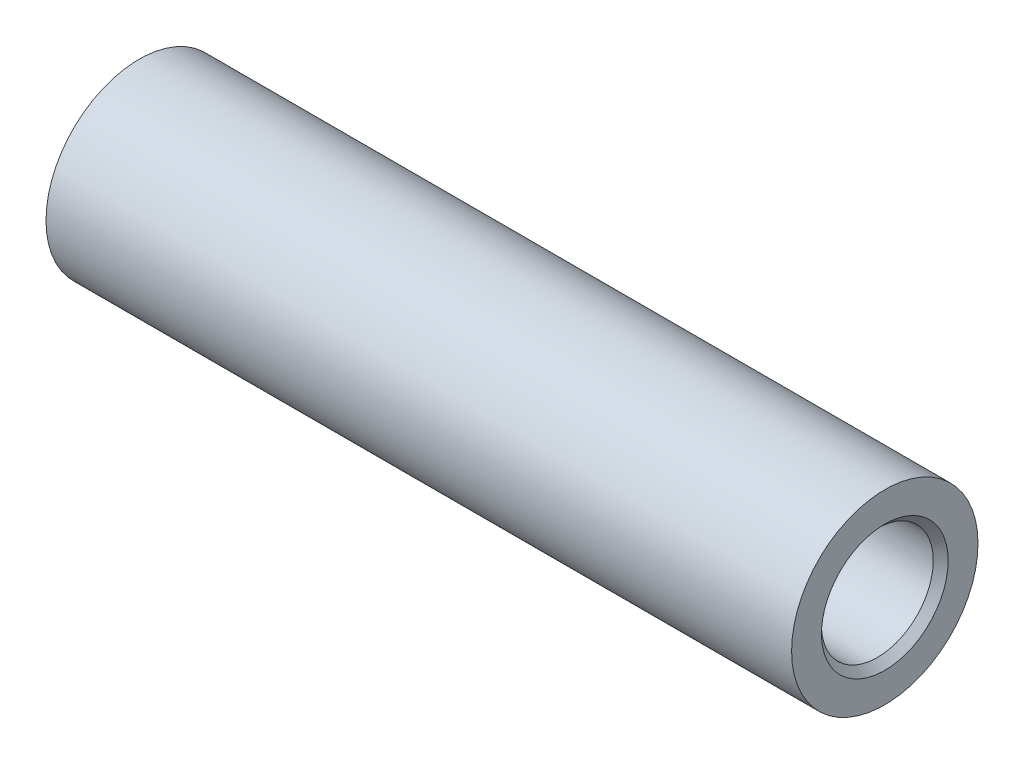
ISO-10303-21;
HEADER;
FILE_DESCRIPTION(('STEP AP214'),'2;1');
FILE_NAME('part.step','',(''),(''),'','','');
FILE_SCHEMA(('AUTOMOTIVE_DESIGN { 1 0 10303 214 1 1 1 1 }'));
ENDSEC;
DATA;
#1=APPLICATION_CONTEXT('core data for automotive mechanical design processes');
#2=APPLICATION_PROTOCOL_DEFINITION('international standard','automotive_design',2000,#1);
#3=PRODUCT_CONTEXT('',#1,'mechanical');
#4=PRODUCT('Part','Part','',(#3));
#5=PRODUCT_RELATED_PRODUCT_CATEGORY('part','',(#4));
#6=PRODUCT_DEFINITION_FORMATION('','',#4);
#7=PRODUCT_DEFINITION_CONTEXT('part definition',#1,'design');
#8=PRODUCT_DEFINITION('design','',#6,#7);
#9=PRODUCT_DEFINITION_SHAPE('','',#8);
#10=(LENGTH_UNIT() NAMED_UNIT(*) SI_UNIT(.MILLI.,.METRE.));
#11=(NAMED_UNIT(*) PLANE_ANGLE_UNIT() SI_UNIT($,.RADIAN.));
#12=(NAMED_UNIT(*) SI_UNIT($,.STERADIAN.) SOLID_ANGLE_UNIT());
#13=UNCERTAINTY_MEASURE_WITH_UNIT(LENGTH_MEASURE(1.E-05),#10,'distance_accuracy_value','');
#14=(GEOMETRIC_REPRESENTATION_CONTEXT(3) GLOBAL_UNCERTAINTY_ASSIGNED_CONTEXT((#13)) GLOBAL_UNIT_ASSIGNED_CONTEXT((#10,
#11,#12)) REPRESENTATION_CONTEXT('',''));
#15=CARTESIAN_POINT('',(0.,0.,0.));
#16=DIRECTION('',(0.,0.,1.));
#17=DIRECTION('',(1.,0.,0.));
#18=AXIS2_PLACEMENT_3D('',#15,#16,#17);
#19=CARTESIAN_POINT('',(14.,0.,0.));
#20=DIRECTION('',(-1.,0.,0.));
#21=DIRECTION('',(0.,0.,1.));
#22=AXIS2_PLACEMENT_3D('',#19,#20,#21);
#23=CYLINDRICAL_SURFACE('',#22,3.);
#24=CARTESIAN_POINT('',(2.,0.,0.));
#25=DIRECTION('',(1.,0.,0.));
#26=DIRECTION('',(0.,0.,-1.));
#27=AXIS2_PLACEMENT_3D('',#24,#25,#26);
#28=CIRCLE('',#27,3.);
#29=CARTESIAN_POINT('',(2.,2.5,-1.6583123951777));
#30=VERTEX_POINT('',#29);
#31=CARTESIAN_POINT('',(2.,2.5,1.6583123951777));
#32=VERTEX_POINT('',#31);
#33=EDGE_CURVE('E88',#30,#32,#28,.T.);
#34=ORIENTED_EDGE('',*,*,#33,.T.);
#35=DIRECTION('',(-1.,0.,0.));
#36=VECTOR('',#35,1.);
#37=CARTESIAN_POINT('',(14.,2.5,1.6583123951777));
#38=LINE('',#37,#36);
#39=CARTESIAN_POINT('',(14.,2.5,1.6583123951777));
#40=VERTEX_POINT('',#39);
#41=EDGE_CURVE('E12',#40,#32,#38,.T.);
#42=ORIENTED_EDGE('',*,*,#41,.F.);
#43=CARTESIAN_POINT('',(14.,0.,0.));
#44=DIRECTION('',(1.,0.,0.));
#45=DIRECTION('',(0.,0.,-1.));
#46=AXIS2_PLACEMENT_3D('',#43,#44,#45);
#47=CIRCLE('',#46,3.);
#48=CARTESIAN_POINT('',(14.,2.5,-1.6583123951777));
#49=VERTEX_POINT('',#48);
#50=EDGE_CURVE('E87',#49,#40,#47,.T.);
#51=ORIENTED_EDGE('',*,*,#50,.F.);
#52=DIRECTION('',(-1.,0.,0.));
#53=VECTOR('',#52,1.);
#54=CARTESIAN_POINT('',(14.,2.5,-1.6583123951777));
#55=LINE('',#54,#53);
#56=EDGE_CURVE('E65',#49,#30,#55,.T.);
#57=ORIENTED_EDGE('',*,*,#56,.T.);
#58=EDGE_LOOP('',(#34,#42,#51,#57));
#59=FACE_BOUND('',#58,.T.);
#60=ADVANCED_FACE('F57',(#59),#23,.T.);
#61=CARTESIAN_POINT('',(14.,2.5,1.6583123951777));
#62=DIRECTION('',(0.,1.,0.));
#63=DIRECTION('',(0.,0.,1.));
#64=AXIS2_PLACEMENT_3D('',#61,#62,#63);
#65=PLANE('',#64);
#66=DIRECTION('',(0.,0.,-1.));
#67=VECTOR('',#66,1.);
#68=CARTESIAN_POINT('',(2.,2.5,1.6583123951777));
#69=LINE('',#68,#67);
#70=EDGE_CURVE('E80',#32,#30,#69,.T.);
#71=ORIENTED_EDGE('',*,*,#70,.T.);
#72=ORIENTED_EDGE('',*,*,#56,.F.);
#73=DIRECTION('',(0.,0.,-1.));
#74=VECTOR('',#73,1.);
#75=CARTESIAN_POINT('',(14.,2.5,1.6583123951777));
#76=LINE('',#75,#74);
#77=EDGE_CURVE('E72',#40,#49,#76,.T.);
#78=ORIENTED_EDGE('',*,*,#77,.F.);
#79=ORIENTED_EDGE('',*,*,#41,.T.);
#80=EDGE_LOOP('',(#71,#72,#78,#79));
#81=FACE_BOUND('',#80,.T.);
#82=ADVANCED_FACE('F83',(#81),#65,.F.);
#83=CARTESIAN_POINT('',(14.,0.,0.));
#84=DIRECTION('',(1.,0.,0.));
#85=DIRECTION('',(0.,0.,-1.));
#86=AXIS2_PLACEMENT_3D('',#83,#84,#85);
#87=PLANE('',#86);
#88=ORIENTED_EDGE('',*,*,#50,.T.);
#89=ORIENTED_EDGE('',*,*,#77,.T.);
#90=EDGE_LOOP('',(#88,#89));
#91=FACE_BOUND('',#90,.T.);
#92=ADVANCED_FACE('F95',(#91),#87,.T.);
#93=CARTESIAN_POINT('',(2.,0.,0.));
#94=DIRECTION('',(1.,0.,0.));
#95=DIRECTION('',(0.,0.,-1.));
#96=AXIS2_PLACEMENT_3D('',#93,#94,#95);
#97=PLANE('',#96);
#98=ORIENTED_EDGE('',*,*,#33,.F.);
#99=ORIENTED_EDGE('',*,*,#70,.F.);
#100=EDGE_LOOP('',(#98,#99));
#101=FACE_BOUND('',#100,.T.);
#102=ADVANCED_FACE('F91',(#101),#97,.F.);
#103=CLOSED_SHELL('',(#60,#82,#92,#102));
#104=MANIFOLD_SOLID_BREP('B2',#103);
#105=CARTESIAN_POINT('',(0.,0.,0.));
#106=DIRECTION('',(-1.,0.,0.));
#107=DIRECTION('',(0.,0.,1.));
#108=AXIS2_PLACEMENT_3D('',#105,#106,#107);
#109=CYLINDRICAL_SURFACE('',#108,4.);
#110=CARTESIAN_POINT('',(-20.6,0.,0.));
#111=DIRECTION('',(1.,0.,0.));
#112=DIRECTION('',(0.,0.,-1.));
#113=AXIS2_PLACEMENT_3D('',#110,#111,#112);
#114=CIRCLE('',#113,4.);
#115=CARTESIAN_POINT('',(-20.6,0.,-4.));
#116=VERTEX_POINT('',#115);
#117=EDGE_CURVE('E147',#116,#116,#114,.F.);
#118=ORIENTED_EDGE('',*,*,#117,.T.);
#119=EDGE_LOOP('',(#118));
#120=FACE_BOUND('',#119,.T.);
#121=DIRECTION('',(1.,0.,0.));
#122=VECTOR('',#121,1.);
#123=CARTESIAN_POINT('',(-15.,3.52019103303803,-1.89954075789877));
#124=LINE('',#123,#122);
#125=CARTESIAN_POINT('',(-15.,3.52019103303803,-1.89954075789877));
#126=VERTEX_POINT('',#125);
#127=CARTESIAN_POINT('',(0.,3.52019103303803,-1.89954075789877));
#128=VERTEX_POINT('',#127);
#129=EDGE_CURVE('E154',#126,#128,#124,.T.);
#130=ORIENTED_EDGE('',*,*,#129,.F.);
#131=CARTESIAN_POINT('',(-15.,0.,0.));
#132=DIRECTION('',(-1.,0.,0.));
#133=DIRECTION('',(0.,0.,1.));
#134=AXIS2_PLACEMENT_3D('',#131,#132,#133);
#135=CIRCLE('',#134,4.);
#136=CARTESIAN_POINT('',(-15.,3.47942111272299,1.97322799502174));
#137=VERTEX_POINT('',#136);
#138=EDGE_CURVE('E174',#137,#126,#135,.T.);
#139=ORIENTED_EDGE('',*,*,#138,.F.);
#140=DIRECTION('',(1.,0.,0.));
#141=VECTOR('',#140,1.);
#142=CARTESIAN_POINT('',(-15.,3.47942111272299,1.97322799502174));
#143=LINE('',#142,#141);
#144=CARTESIAN_POINT('',(0.,3.47942111272299,1.97322799502174));
#145=VERTEX_POINT('',#144);
#146=EDGE_CURVE('E168',#137,#145,#143,.T.);
#147=ORIENTED_EDGE('',*,*,#146,.T.);
#148=CARTESIAN_POINT('',(0.,0.,0.));
#149=DIRECTION('',(-1.,0.,0.));
#150=DIRECTION('',(0.,0.,1.));
#151=AXIS2_PLACEMENT_3D('',#148,#149,#150);
#152=CIRCLE('',#151,4.);
#153=EDGE_CURVE('E177',#128,#145,#152,.T.);
#154=ORIENTED_EDGE('',*,*,#153,.F.);
#155=EDGE_LOOP('',(#130,#139,#147,#154));
#156=FACE_BOUND('',#155,.T.);
#157=ADVANCED_FACE('F137',(#120,#156),#109,.F.);
#158=CARTESIAN_POINT('',(0.,0.,0.));
#159=DIRECTION('',(-1.,0.,0.));
#160=DIRECTION('',(0.,0.,1.));
#161=AXIS2_PLACEMENT_3D('',#158,#159,#160);
#162=PLANE('',#161);
#163=ORIENTED_EDGE('',*,*,#153,.T.);
#164=DIRECTION('',(0.,-0.0105267481604234,0.999944592251574));
#165=VECTOR('',#164,1.);
#166=CARTESIAN_POINT('',(0.,3.52019103303803,-1.89954075789877));
#167=LINE('',#166,#165);
#168=EDGE_CURVE('E165',#128,#145,#167,.T.);
#169=ORIENTED_EDGE('',*,*,#168,.F.);
#170=EDGE_LOOP('',(#163,#169));
#171=FACE_BOUND('',#170,.T.);
#172=ADVANCED_FACE('F180',(#171),#162,.T.);
#173=CARTESIAN_POINT('',(-21.,0.,0.));
#174=DIRECTION('',(1.,0.,0.));
#175=DIRECTION('',(0.,0.,-1.));
#176=AXIS2_PLACEMENT_3D('',#173,#174,#175);
#177=CYLINDRICAL_SURFACE('',#176,5.);
#178=CARTESIAN_POINT('',(-21.,0.,0.));
#179=DIRECTION('',(1.,0.,0.));
#180=DIRECTION('',(0.,0.,-1.));
#181=AXIS2_PLACEMENT_3D('',#178,#179,#180);
#182=CIRCLE('',#181,5.);
#183=CARTESIAN_POINT('',(-21.,0.,-5.));
#184=VERTEX_POINT('',#183);
#185=EDGE_CURVE('E194',#184,#184,#182,.T.);
#186=CARTESIAN_POINT('',(19.,0.,0.));
#187=DIRECTION('',(1.,0.,0.));
#188=DIRECTION('',(0.,0.,-1.));
#189=AXIS2_PLACEMENT_3D('',#186,#187,#188);
#190=CIRCLE('',#189,5.);
#191=CARTESIAN_POINT('',(19.,0.,-5.));
#192=VERTEX_POINT('',#191);
#193=EDGE_CURVE('E187',#192,#192,#190,.T.);
#194=CARTESIAN_POINT('',(-21.,0.,-5.));
#195=CARTESIAN_POINT('',(-20.5833333333333,0.,-5.));
#196=CARTESIAN_POINT('',(-20.1666666666667,0.,-5.));
#197=CARTESIAN_POINT('',(-19.3333333333333,0.,-5.));
#198=CARTESIAN_POINT('',(-18.9166666666667,0.,-5.));
#199=CARTESIAN_POINT('',(-18.0833333333333,0.,-5.));
#200=CARTESIAN_POINT('',(-17.6666666666667,0.,-5.));
#201=CARTESIAN_POINT('',(-16.8333333333333,0.,-5.));
#202=CARTESIAN_POINT('',(-16.4166666666667,0.,-5.));
#203=CARTESIAN_POINT('',(-15.5833333333333,0.,-5.));
#204=CARTESIAN_POINT('',(-15.1666666666667,0.,-5.));
#205=CARTESIAN_POINT('',(-14.3333333333333,0.,-5.));
#206=CARTESIAN_POINT('',(-13.9166666666667,0.,-5.));
#207=CARTESIAN_POINT('',(-13.0833333333333,0.,-5.));
#208=CARTESIAN_POINT('',(-12.6666666666667,0.,-5.));
#209=CARTESIAN_POINT('',(-11.8333333333333,0.,-5.));
#210=CARTESIAN_POINT('',(-11.4166666666667,0.,-5.));
#211=CARTESIAN_POINT('',(-10.5833333333333,0.,-5.));
#212=CARTESIAN_POINT('',(-10.1666666666667,0.,-5.));
#213=CARTESIAN_POINT('',(-9.33333333333334,0.,-5.));
#214=CARTESIAN_POINT('',(-8.91666666666667,0.,-5.));
#215=CARTESIAN_POINT('',(-8.08333333333334,0.,-5.));
#216=CARTESIAN_POINT('',(-7.66666666666667,0.,-5.));
#217=CARTESIAN_POINT('',(-6.83333333333334,0.,-5.));
#218=CARTESIAN_POINT('',(-6.41666666666667,0.,-5.));
#219=CARTESIAN_POINT('',(-5.58333333333334,0.,-5.));
#220=CARTESIAN_POINT('',(-5.16666666666667,0.,-5.));
#221=CARTESIAN_POINT('',(-4.33333333333334,0.,-5.));
#222=CARTESIAN_POINT('',(-3.91666666666667,0.,-5.));
#223=CARTESIAN_POINT('',(-3.08333333333334,0.,-5.));
#224=CARTESIAN_POINT('',(-2.66666666666667,0.,-5.));
#225=CARTESIAN_POINT('',(-1.83333333333334,0.,-5.));
#226=CARTESIAN_POINT('',(-1.41666666666667,0.,-5.));
#227=CARTESIAN_POINT('',(-0.583333333333337,0.,-5.));
#228=CARTESIAN_POINT('',(-0.16666666666667,0.,-5.));
#229=CARTESIAN_POINT('',(0.666666666666664,0.,-5.));
#230=CARTESIAN_POINT('',(1.08333333333333,0.,-5.));
#231=CARTESIAN_POINT('',(1.91666666666666,0.,-5.));
#232=CARTESIAN_POINT('',(2.33333333333333,0.,-5.));
#233=CARTESIAN_POINT('',(3.16666666666666,0.,-5.));
#234=CARTESIAN_POINT('',(3.58333333333333,0.,-5.));
#235=CARTESIAN_POINT('',(4.41666666666666,0.,-5.));
#236=CARTESIAN_POINT('',(4.83333333333333,0.,-5.));
#237=CARTESIAN_POINT('',(5.66666666666666,0.,-5.));
#238=CARTESIAN_POINT('',(6.08333333333333,0.,-5.));
#239=CARTESIAN_POINT('',(6.91666666666666,0.,-5.));
#240=CARTESIAN_POINT('',(7.33333333333333,0.,-5.));
#241=CARTESIAN_POINT('',(8.16666666666666,0.,-5.));
#242=CARTESIAN_POINT('',(8.58333333333333,0.,-5.));
#243=CARTESIAN_POINT('',(9.41666666666667,0.,-5.));
#244=CARTESIAN_POINT('',(9.83333333333333,0.,-5.));
#245=CARTESIAN_POINT('',(10.6666666666667,0.,-5.));
#246=CARTESIAN_POINT('',(11.0833333333333,0.,-5.));
#247=CARTESIAN_POINT('',(11.9166666666667,0.,-5.));
#248=CARTESIAN_POINT('',(12.3333333333333,0.,-5.));
#249=CARTESIAN_POINT('',(13.1666666666667,0.,-5.));
#250=CARTESIAN_POINT('',(13.5833333333333,0.,-5.));
#251=CARTESIAN_POINT('',(14.4166666666667,0.,-5.));
#252=CARTESIAN_POINT('',(14.8333333333333,0.,-5.));
#253=CARTESIAN_POINT('',(15.6666666666667,0.,-5.));
#254=CARTESIAN_POINT('',(16.0833333333333,0.,-5.));
#255=CARTESIAN_POINT('',(16.9166666666667,0.,-5.));
#256=CARTESIAN_POINT('',(17.3333333333333,0.,-5.));
#257=CARTESIAN_POINT('',(18.1666666666667,0.,-5.));
#258=CARTESIAN_POINT('',(18.5833333333333,0.,-5.));
#259=CARTESIAN_POINT('',(19.,0.,-5.));
#260=B_SPLINE_CURVE_WITH_KNOTS('',3,(#194,#195,#196,#197,#198,#199,#200,#201,#202,#203,#204,
#205,#206,#207,#208,#209,#210,#211,#212,#213,#214,#215,#216,#217,#218,#219,#220,#221,#222,#223,
#224,#225,#226,#227,#228,#229,#230,#231,#232,#233,#234,#235,#236,#237,#238,#239,#240,#241,#242,
#243,#244,#245,#246,#247,#248,#249,#250,#251,#252,#253,#254,#255,#256,#257,#258,#259),
.UNSPECIFIED.,.F.,.F.,(4,2,2,2,2,2,2,2,2,2,2,2,2,2,2,2,2,2,2,2,2,2,2,2,2,2,2,2,2,2,2,2,4),(0.,
1.25,2.5,3.75,5.,6.25,7.5,8.75,10.,11.25,12.5,13.75,15.,16.25,17.5,18.75,20.,21.25,22.5,23.75,
25.,26.25,27.5,28.75,30.,31.25,32.5,33.75,35.,36.25,37.5,38.75,40.),.UNSPECIFIED.);
#261=EDGE_CURVE('BSEAM224',#184,#192,#260,.T.);
#262=ORIENTED_EDGE('',*,*,#185,.T.);
#263=ORIENTED_EDGE('',*,*,#193,.F.);
#264=ORIENTED_EDGE('',*,*,#261,.T.);
#265=ORIENTED_EDGE('',*,*,#261,.F.);
#266=EDGE_LOOP('',(#262,#264,#263,#265));
#267=FACE_BOUND('',#266,.T.);
#268=ADVANCED_FACE('F224',(#267),#177,.T.);
#269=CARTESIAN_POINT('',(-21.,0.,0.));
#270=DIRECTION('',(1.,0.,0.));
#271=DIRECTION('',(0.,0.,-1.));
#272=AXIS2_PLACEMENT_3D('',#269,#270,#271);
#273=PLANE('',#272);
#274=CARTESIAN_POINT('',(-21.,0.,0.));
#275=DIRECTION('',(1.,0.,0.));
#276=DIRECTION('',(0.,0.,-1.));
#277=AXIS2_PLACEMENT_3D('',#274,#275,#276);
#278=CIRCLE('',#277,4.40000000000003);
#279=CARTESIAN_POINT('',(-21.,0.,-4.40000000000003));
#280=VERTEX_POINT('',#279);
#281=EDGE_CURVE('E55',#280,#280,#278,.T.);
#282=ORIENTED_EDGE('',*,*,#281,.T.);
#283=EDGE_LOOP('',(#282));
#284=FACE_BOUND('',#283,.T.);
#285=ORIENTED_EDGE('',*,*,#185,.F.);
#286=EDGE_LOOP('',(#285));
#287=FACE_BOUND('',#286,.T.);
#288=ADVANCED_FACE('F239',(#284,#287),#273,.F.);
#289=CARTESIAN_POINT('',(19.,0.,0.));
#290=DIRECTION('',(1.,0.,0.));
#291=DIRECTION('',(0.,0.,-1.));
#292=AXIS2_PLACEMENT_3D('',#289,#290,#291);
#293=PLANE('',#292);
#294=CARTESIAN_POINT('',(19.,0.,0.));
#295=DIRECTION('',(1.,0.,0.));
#296=DIRECTION('',(0.,0.,-1.));
#297=AXIS2_PLACEMENT_3D('',#294,#295,#296);
#298=CIRCLE('',#297,3.4);
#299=CARTESIAN_POINT('',(19.,0.,-3.4));
#300=VERTEX_POINT('',#299);
#301=EDGE_CURVE('E202',#300,#300,#298,.F.);
#302=ORIENTED_EDGE('',*,*,#301,.T.);
#303=EDGE_LOOP('',(#302));
#304=FACE_BOUND('',#303,.T.);
#305=ORIENTED_EDGE('',*,*,#193,.T.);
#306=EDGE_LOOP('',(#305));
#307=FACE_BOUND('',#306,.T.);
#308=ADVANCED_FACE('F235',(#304,#307),#293,.T.);
#309=CARTESIAN_POINT('',(2.,0.,0.));
#310=DIRECTION('',(1.,0.,0.));
#311=DIRECTION('',(0.,0.,-1.));
#312=AXIS2_PLACEMENT_3D('',#309,#310,#311);
#313=CYLINDRICAL_SURFACE('',#312,3.);
#314=CARTESIAN_POINT('',(18.6,0.,0.));
#315=DIRECTION('',(1.,0.,0.));
#316=DIRECTION('',(0.,0.,-1.));
#317=AXIS2_PLACEMENT_3D('',#314,#315,#316);
#318=CIRCLE('',#317,3.);
#319=CARTESIAN_POINT('',(18.6,0.,-3.));
#320=VERTEX_POINT('',#319);
#321=EDGE_CURVE('E198',#320,#320,#318,.T.);
#322=ORIENTED_EDGE('',*,*,#321,.T.);
#323=EDGE_LOOP('',(#322));
#324=FACE_BOUND('',#323,.T.);
#325=CARTESIAN_POINT('',(2.,0.,0.));
#326=DIRECTION('',(1.,0.,0.));
#327=DIRECTION('',(0.,0.,-1.));
#328=AXIS2_PLACEMENT_3D('',#325,#326,#327);
#329=CIRCLE('',#328,3.);
#330=CARTESIAN_POINT('',(2.,0.,-3.));
#331=VERTEX_POINT('',#330);
#332=EDGE_CURVE('E182',#331,#331,#329,.T.);
#333=ORIENTED_EDGE('',*,*,#332,.F.);
#334=EDGE_LOOP('',(#333));
#335=FACE_BOUND('',#334,.T.);
#336=ADVANCED_FACE('F231',(#324,#335),#313,.F.);
#337=CARTESIAN_POINT('',(2.,0.,0.));
#338=DIRECTION('',(1.,0.,0.));
#339=DIRECTION('',(0.,0.,-1.));
#340=AXIS2_PLACEMENT_3D('',#337,#338,#339);
#341=PLANE('',#340);
#342=ORIENTED_EDGE('',*,*,#332,.T.);
#343=EDGE_LOOP('',(#342));
#344=FACE_BOUND('',#343,.T.);
#345=ADVANCED_FACE('F228',(#344),#341,.T.);
#346=CARTESIAN_POINT('',(-15.,3.52019103303803,-1.89954075789877));
#347=DIRECTION('',(0.,0.999944592251574,0.0105267481604234));
#348=DIRECTION('',(0.,-0.0105267481604234,0.999944592251574));
#349=AXIS2_PLACEMENT_3D('',#346,#347,#348);
#350=PLANE('',#349);
#351=ORIENTED_EDGE('',*,*,#168,.T.);
#352=ORIENTED_EDGE('',*,*,#146,.F.);
#353=DIRECTION('',(0.,-0.0105267481604234,0.999944592251574));
#354=VECTOR('',#353,1.);
#355=CARTESIAN_POINT('',(-15.,3.52019103303803,-1.89954075789877));
#356=LINE('',#355,#354);
#357=EDGE_CURVE('E161',#126,#137,#356,.T.);
#358=ORIENTED_EDGE('',*,*,#357,.F.);
#359=ORIENTED_EDGE('',*,*,#129,.T.);
#360=EDGE_LOOP('',(#351,#352,#358,#359));
#361=FACE_BOUND('',#360,.T.);
#362=ADVANCED_FACE('F167',(#361),#350,.F.);
#363=CARTESIAN_POINT('',(-15.,0.,0.));
#364=DIRECTION('',(-1.,0.,0.));
#365=DIRECTION('',(0.,0.,1.));
#366=AXIS2_PLACEMENT_3D('',#363,#364,#365);
#367=PLANE('',#366);
#368=ORIENTED_EDGE('',*,*,#138,.T.);
#369=ORIENTED_EDGE('',*,*,#357,.T.);
#370=EDGE_LOOP('',(#368,#369));
#371=FACE_BOUND('',#370,.T.);
#372=ADVANCED_FACE('F216',(#371),#367,.T.);
#373=CARTESIAN_POINT('',(18.6,0.,0.));
#374=DIRECTION('',(1.,0.,0.));
#375=DIRECTION('',(0.,0.,-1.));
#376=AXIS2_PLACEMENT_3D('',#373,#374,#375);
#377=CONICAL_SURFACE('',#376,3.,0.785398163397447);
#378=ORIENTED_EDGE('',*,*,#301,.F.);
#379=EDGE_LOOP('',(#378));
#380=FACE_BOUND('',#379,.T.);
#381=ORIENTED_EDGE('',*,*,#321,.F.);
#382=EDGE_LOOP('',(#381));
#383=FACE_BOUND('',#382,.T.);
#384=ADVANCED_FACE('F211',(#380,#383),#377,.F.);
#385=CARTESIAN_POINT('',(-20.6,0.,0.));
#386=DIRECTION('',(-1.,0.,0.));
#387=DIRECTION('',(0.,0.,1.));
#388=AXIS2_PLACEMENT_3D('',#385,#386,#387);
#389=CONICAL_SURFACE('',#388,4.,0.785398163397447);
#390=ORIENTED_EDGE('',*,*,#281,.F.);
#391=EDGE_LOOP('',(#390));
#392=FACE_BOUND('',#391,.T.);
#393=ORIENTED_EDGE('',*,*,#117,.F.);
#394=EDGE_LOOP('',(#393));
#395=FACE_BOUND('',#394,.T.);
#396=ADVANCED_FACE('F140',(#392,#395),#389,.F.);
#397=CLOSED_SHELL('',(#157,#172,#268,#288,#308,#336,#345,#362,#372,#384,#396));
#398=MANIFOLD_SOLID_BREP('B6',#397);
#399=ADVANCED_BREP_SHAPE_REPRESENTATION('',(#18,#104,#398),#14);
#400=SHAPE_DEFINITION_REPRESENTATION(#9,#399);
ENDSEC;
END-ISO-10303-21;
